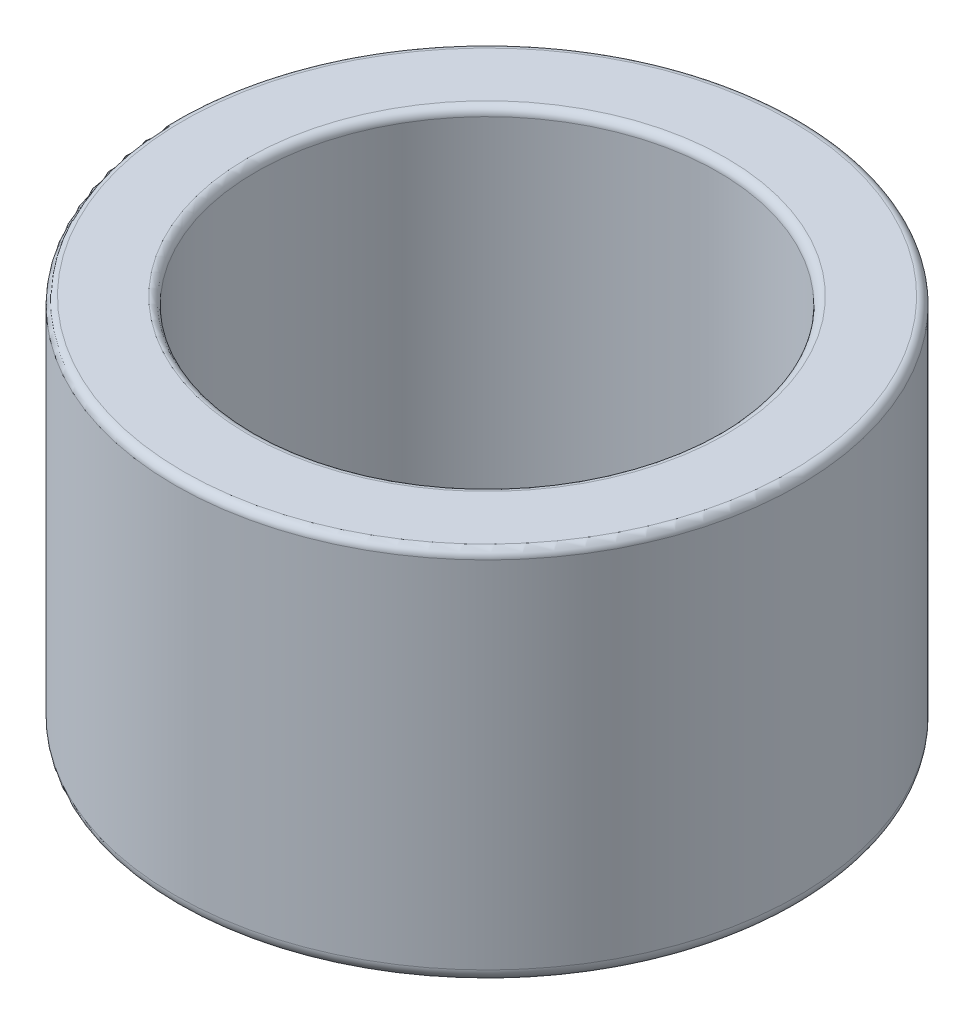
ISO-10303-21;
HEADER;
FILE_DESCRIPTION(('STEP AP214'),'2;1');
FILE_NAME('part.step','',(''),(''),'','','');
FILE_SCHEMA(('AUTOMOTIVE_DESIGN { 1 0 10303 214 1 1 1 1 }'));
ENDSEC;
DATA;
#1=APPLICATION_CONTEXT('core data for automotive mechanical design processes');
#2=APPLICATION_PROTOCOL_DEFINITION('international standard','automotive_design',2000,#1);
#3=PRODUCT_CONTEXT('',#1,'mechanical');
#4=PRODUCT('Part','Part','',(#3));
#5=PRODUCT_RELATED_PRODUCT_CATEGORY('part','',(#4));
#6=PRODUCT_DEFINITION_FORMATION('','',#4);
#7=PRODUCT_DEFINITION_CONTEXT('part definition',#1,'design');
#8=PRODUCT_DEFINITION('design','',#6,#7);
#9=PRODUCT_DEFINITION_SHAPE('','',#8);
#10=(LENGTH_UNIT() NAMED_UNIT(*) SI_UNIT(.MILLI.,.METRE.));
#11=(NAMED_UNIT(*) PLANE_ANGLE_UNIT() SI_UNIT($,.RADIAN.));
#12=(NAMED_UNIT(*) SI_UNIT($,.STERADIAN.) SOLID_ANGLE_UNIT());
#13=UNCERTAINTY_MEASURE_WITH_UNIT(LENGTH_MEASURE(1.E-05),#10,'distance_accuracy_value','');
#14=(GEOMETRIC_REPRESENTATION_CONTEXT(3) GLOBAL_UNCERTAINTY_ASSIGNED_CONTEXT((#13)) GLOBAL_UNIT_ASSIGNED_CONTEXT((#10,
#11,#12)) REPRESENTATION_CONTEXT('',''));
#15=CARTESIAN_POINT('',(0.,0.,0.));
#16=DIRECTION('',(0.,0.,1.));
#17=DIRECTION('',(1.,0.,0.));
#18=AXIS2_PLACEMENT_3D('',#15,#16,#17);
#19=CARTESIAN_POINT('',(0.,14.,0.));
#20=DIRECTION('',(0.,1.,0.));
#21=DIRECTION('',(0.,0.,1.));
#22=AXIS2_PLACEMENT_3D('',#19,#20,#21);
#23=PLANE('',#22);
#24=CARTESIAN_POINT('',(0.,14.,0.));
#25=DIRECTION('',(0.,1.,0.));
#26=DIRECTION('',(0.,0.,1.));
#27=AXIS2_PLACEMENT_3D('',#24,#25,#26);
#28=CIRCLE('',#27,8.89435);
#29=CARTESIAN_POINT('',(0.,14.,8.89435));
#30=VERTEX_POINT('',#29);
#31=EDGE_CURVE('E53',#30,#30,#28,.F.);
#32=ORIENTED_EDGE('',*,*,#31,.T.);
#33=EDGE_LOOP('',(#32));
#34=FACE_BOUND('',#33,.T.);
#35=CARTESIAN_POINT('',(0.,14.,0.));
#36=DIRECTION('',(0.,1.,0.));
#37=DIRECTION('',(0.,0.,1.));
#38=AXIS2_PLACEMENT_3D('',#35,#36,#37);
#39=CIRCLE('',#38,11.29435);
#40=CARTESIAN_POINT('',(0.,14.,11.29435));
#41=VERTEX_POINT('',#40);
#42=EDGE_CURVE('E62',#41,#41,#39,.T.);
#43=ORIENTED_EDGE('',*,*,#42,.T.);
#44=EDGE_LOOP('',(#43));
#45=FACE_BOUND('',#44,.T.);
#46=ADVANCED_FACE('F33',(#34,#45),#23,.T.);
#47=CARTESIAN_POINT('',(0.,0.,0.));
#48=DIRECTION('',(0.,1.,0.));
#49=DIRECTION('',(0.,0.,1.));
#50=AXIS2_PLACEMENT_3D('',#47,#48,#49);
#51=PLANE('',#50);
#52=CARTESIAN_POINT('',(0.,0.,0.));
#53=DIRECTION('',(0.,1.,0.));
#54=DIRECTION('',(0.,0.,1.));
#55=AXIS2_PLACEMENT_3D('',#52,#53,#54);
#56=CIRCLE('',#55,9.09435);
#57=CARTESIAN_POINT('',(0.,0.,9.09435));
#58=VERTEX_POINT('',#57);
#59=EDGE_CURVE('E40',#58,#58,#56,.T.);
#60=ORIENTED_EDGE('',*,*,#59,.T.);
#61=EDGE_LOOP('',(#60));
#62=FACE_BOUND('',#61,.T.);
#63=CARTESIAN_POINT('',(0.,0.,0.));
#64=DIRECTION('',(0.,1.,0.));
#65=DIRECTION('',(0.,0.,1.));
#66=AXIS2_PLACEMENT_3D('',#63,#64,#65);
#67=CIRCLE('',#66,11.09435);
#68=CARTESIAN_POINT('',(0.,0.,11.09435));
#69=VERTEX_POINT('',#68);
#70=EDGE_CURVE('E44',#69,#69,#67,.F.);
#71=ORIENTED_EDGE('',*,*,#70,.T.);
#72=EDGE_LOOP('',(#71));
#73=FACE_BOUND('',#72,.T.);
#74=ADVANCED_FACE('F85',(#62,#73),#51,.F.);
#75=CARTESIAN_POINT('',(0.,14.,0.));
#76=DIRECTION('',(0.,-1.,0.));
#77=DIRECTION('',(0.,0.,-1.));
#78=AXIS2_PLACEMENT_3D('',#75,#76,#77);
#79=CYLINDRICAL_SURFACE('',#78,11.59435);
#80=CARTESIAN_POINT('',(0.,0.5,0.));
#81=DIRECTION('',(0.,1.,0.));
#82=DIRECTION('',(0.,0.,1.));
#83=AXIS2_PLACEMENT_3D('',#80,#81,#82);
#84=CIRCLE('',#83,11.59435);
#85=CARTESIAN_POINT('',(0.,0.5,11.59435));
#86=VERTEX_POINT('',#85);
#87=EDGE_CURVE('E48',#86,#86,#84,.T.);
#88=ORIENTED_EDGE('',*,*,#87,.T.);
#89=EDGE_LOOP('',(#88));
#90=FACE_BOUND('',#89,.T.);
#91=CARTESIAN_POINT('',(0.,13.7,0.));
#92=DIRECTION('',(0.,1.,0.));
#93=DIRECTION('',(0.,0.,1.));
#94=AXIS2_PLACEMENT_3D('',#91,#92,#93);
#95=CIRCLE('',#94,11.59435);
#96=CARTESIAN_POINT('',(0.,13.7,11.59435));
#97=VERTEX_POINT('',#96);
#98=EDGE_CURVE('E59',#97,#97,#95,.F.);
#99=ORIENTED_EDGE('',*,*,#98,.T.);
#100=EDGE_LOOP('',(#99));
#101=FACE_BOUND('',#100,.T.);
#102=ADVANCED_FACE('F80',(#90,#101),#79,.T.);
#103=CARTESIAN_POINT('',(0.,14.,0.));
#104=DIRECTION('',(0.,-1.,0.));
#105=DIRECTION('',(0.,0.,-1.));
#106=AXIS2_PLACEMENT_3D('',#103,#104,#105);
#107=CYLINDRICAL_SURFACE('',#106,8.59435);
#108=CARTESIAN_POINT('',(0.,0.5,0.));
#109=DIRECTION('',(0.,1.,0.));
#110=DIRECTION('',(0.,0.,1.));
#111=AXIS2_PLACEMENT_3D('',#108,#109,#110);
#112=CIRCLE('',#111,8.59435);
#113=CARTESIAN_POINT('',(0.,0.5,8.59435));
#114=VERTEX_POINT('',#113);
#115=EDGE_CURVE('E10',#114,#114,#112,.F.);
#116=ORIENTED_EDGE('',*,*,#115,.T.);
#117=EDGE_LOOP('',(#116));
#118=FACE_BOUND('',#117,.T.);
#119=CARTESIAN_POINT('',(0.,13.7,0.));
#120=DIRECTION('',(0.,1.,0.));
#121=DIRECTION('',(0.,0.,1.));
#122=AXIS2_PLACEMENT_3D('',#119,#120,#121);
#123=CIRCLE('',#122,8.59435);
#124=CARTESIAN_POINT('',(0.,13.7,8.59435));
#125=VERTEX_POINT('',#124);
#126=EDGE_CURVE('E56',#125,#125,#123,.T.);
#127=ORIENTED_EDGE('',*,*,#126,.T.);
#128=EDGE_LOOP('',(#127));
#129=FACE_BOUND('',#128,.T.);
#130=ADVANCED_FACE('F70',(#118,#129),#107,.F.);
#131=CARTESIAN_POINT('',(0.,13.7,0.));
#132=DIRECTION('',(0.,1.,0.));
#133=DIRECTION('',(0.,0.,1.));
#134=AXIS2_PLACEMENT_3D('',#131,#132,#133);
#135=TOROIDAL_SURFACE('',#134,11.29435,0.3);
#136=ORIENTED_EDGE('',*,*,#98,.F.);
#137=EDGE_LOOP('',(#136));
#138=FACE_BOUND('',#137,.T.);
#139=ORIENTED_EDGE('',*,*,#42,.F.);
#140=EDGE_LOOP('',(#139));
#141=FACE_BOUND('',#140,.T.);
#142=ADVANCED_FACE('F67',(#138,#141),#135,.T.);
#143=CARTESIAN_POINT('',(0.,13.7,0.));
#144=DIRECTION('',(0.,1.,0.));
#145=DIRECTION('',(0.,0.,1.));
#146=AXIS2_PLACEMENT_3D('',#143,#144,#145);
#147=TOROIDAL_SURFACE('',#146,8.89435,0.3);
#148=ORIENTED_EDGE('',*,*,#31,.F.);
#149=EDGE_LOOP('',(#148));
#150=FACE_BOUND('',#149,.T.);
#151=ORIENTED_EDGE('',*,*,#126,.F.);
#152=EDGE_LOOP('',(#151));
#153=FACE_BOUND('',#152,.T.);
#154=ADVANCED_FACE('F69',(#150,#153),#147,.T.);
#155=CARTESIAN_POINT('',(0.,0.5,0.));
#156=DIRECTION('',(0.,1.,0.));
#157=DIRECTION('',(0.,0.,1.));
#158=AXIS2_PLACEMENT_3D('',#155,#156,#157);
#159=TOROIDAL_SURFACE('',#158,11.09435,0.5);
#160=ORIENTED_EDGE('',*,*,#70,.F.);
#161=EDGE_LOOP('',(#160));
#162=FACE_BOUND('',#161,.T.);
#163=ORIENTED_EDGE('',*,*,#87,.F.);
#164=EDGE_LOOP('',(#163));
#165=FACE_BOUND('',#164,.T.);
#166=ADVANCED_FACE('F77',(#162,#165),#159,.T.);
#167=CARTESIAN_POINT('',(0.,0.5,0.));
#168=DIRECTION('',(0.,1.,0.));
#169=DIRECTION('',(0.,0.,1.));
#170=AXIS2_PLACEMENT_3D('',#167,#168,#169);
#171=TOROIDAL_SURFACE('',#170,9.09435,0.5);
#172=ORIENTED_EDGE('',*,*,#115,.F.);
#173=EDGE_LOOP('',(#172));
#174=FACE_BOUND('',#173,.T.);
#175=ORIENTED_EDGE('',*,*,#59,.F.);
#176=EDGE_LOOP('',(#175));
#177=FACE_BOUND('',#176,.T.);
#178=ADVANCED_FACE('F35',(#174,#177),#171,.T.);
#179=CLOSED_SHELL('',(#46,#74,#102,#130,#142,#154,#166,#178));
#180=MANIFOLD_SOLID_BREP('B2',#179);
#181=ADVANCED_BREP_SHAPE_REPRESENTATION('',(#18,#180),#14);
#182=SHAPE_DEFINITION_REPRESENTATION(#9,#181);
ENDSEC;
END-ISO-10303-21;
